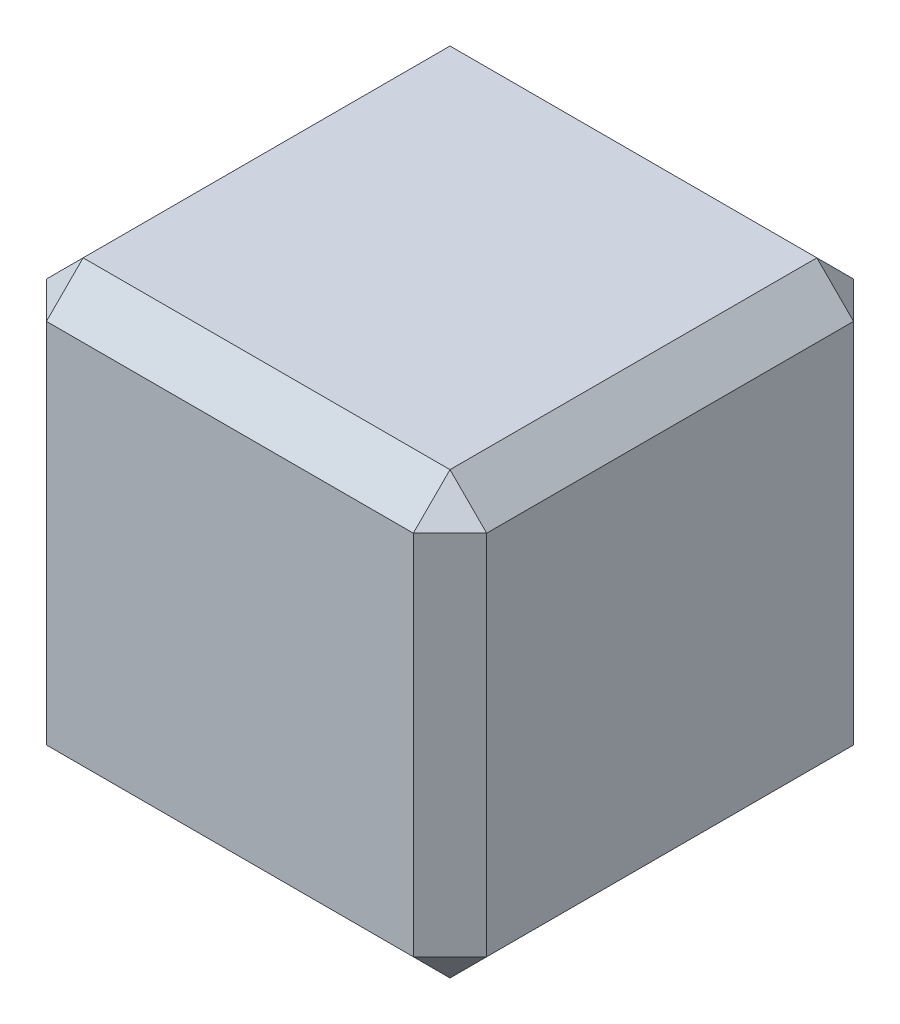
ISO-10303-21;
HEADER;
FILE_DESCRIPTION(('STEP AP214'),'2;1');
FILE_NAME('part.step','',(''),(''),'','','');
FILE_SCHEMA(('AUTOMOTIVE_DESIGN { 1 0 10303 214 1 1 1 1 }'));
ENDSEC;
DATA;
#1=APPLICATION_CONTEXT('core data for automotive mechanical design processes');
#2=APPLICATION_PROTOCOL_DEFINITION('international standard','automotive_design',2000,#1);
#3=PRODUCT_CONTEXT('',#1,'mechanical');
#4=PRODUCT('Part','Part','',(#3));
#5=PRODUCT_RELATED_PRODUCT_CATEGORY('part','',(#4));
#6=PRODUCT_DEFINITION_FORMATION('','',#4);
#7=PRODUCT_DEFINITION_CONTEXT('part definition',#1,'design');
#8=PRODUCT_DEFINITION('design','',#6,#7);
#9=PRODUCT_DEFINITION_SHAPE('','',#8);
#10=(LENGTH_UNIT() NAMED_UNIT(*) SI_UNIT(.MILLI.,.METRE.));
#11=(NAMED_UNIT(*) PLANE_ANGLE_UNIT() SI_UNIT($,.RADIAN.));
#12=(NAMED_UNIT(*) SI_UNIT($,.STERADIAN.) SOLID_ANGLE_UNIT());
#13=UNCERTAINTY_MEASURE_WITH_UNIT(LENGTH_MEASURE(1.E-05),#10,'distance_accuracy_value','');
#14=(GEOMETRIC_REPRESENTATION_CONTEXT(3) GLOBAL_UNCERTAINTY_ASSIGNED_CONTEXT((#13)) GLOBAL_UNIT_ASSIGNED_CONTEXT((#10,
#11,#12)) REPRESENTATION_CONTEXT('',''));
#15=CARTESIAN_POINT('',(0.,0.,0.));
#16=DIRECTION('',(0.,0.,1.));
#17=DIRECTION('',(1.,0.,0.));
#18=AXIS2_PLACEMENT_3D('',#15,#16,#17);
#19=CARTESIAN_POINT('',(3.,3.,-3.));
#20=DIRECTION('',(-1.,0.,0.));
#21=DIRECTION('',(0.,0.,1.));
#22=AXIS2_PLACEMENT_3D('',#19,#20,#21);
#23=PLANE('',#22);
#24=DIRECTION('',(0.,0.,-1.));
#25=VECTOR('',#24,1.);
#26=CARTESIAN_POINT('',(3.,-2.5,-3.));
#27=LINE('',#26,#25);
#28=CARTESIAN_POINT('',(3.,-2.5,2.5));
#29=VERTEX_POINT('',#28);
#30=CARTESIAN_POINT('',(3.,-2.5,-2.5));
#31=VERTEX_POINT('',#30);
#32=EDGE_CURVE('E215',#29,#31,#27,.T.);
#33=ORIENTED_EDGE('',*,*,#32,.T.);
#34=DIRECTION('',(0.,1.,0.));
#35=VECTOR('',#34,1.);
#36=CARTESIAN_POINT('',(3.,3.,-2.5));
#37=LINE('',#36,#35);
#38=CARTESIAN_POINT('',(3.,2.5,-2.5));
#39=VERTEX_POINT('',#38);
#40=EDGE_CURVE('E218',#31,#39,#37,.T.);
#41=ORIENTED_EDGE('',*,*,#40,.T.);
#42=DIRECTION('',(0.,0.,1.));
#43=VECTOR('',#42,1.);
#44=CARTESIAN_POINT('',(3.,2.5,3.));
#45=LINE('',#44,#43);
#46=CARTESIAN_POINT('',(3.,2.5,2.5));
#47=VERTEX_POINT('',#46);
#48=EDGE_CURVE('E216',#39,#47,#45,.T.);
#49=ORIENTED_EDGE('',*,*,#48,.T.);
#50=DIRECTION('',(0.,-1.,0.));
#51=VECTOR('',#50,1.);
#52=CARTESIAN_POINT('',(3.,3.,2.5));
#53=LINE('',#52,#51);
#54=EDGE_CURVE('E212',#47,#29,#53,.T.);
#55=ORIENTED_EDGE('',*,*,#54,.T.);
#56=EDGE_LOOP('',(#33,#41,#49,#55));
#57=FACE_BOUND('',#56,.T.);
#58=ADVANCED_FACE('F33',(#57),#23,.F.);
#59=CARTESIAN_POINT('',(-3.,3.,-3.));
#60=DIRECTION('',(0.,0.,1.));
#61=DIRECTION('',(1.,0.,0.));
#62=AXIS2_PLACEMENT_3D('',#59,#60,#61);
#63=PLANE('',#62);
#64=DIRECTION('',(0.,-1.,0.));
#65=VECTOR('',#64,1.);
#66=CARTESIAN_POINT('',(2.5,3.,-3.));
#67=LINE('',#66,#65);
#68=CARTESIAN_POINT('',(2.5,2.5,-3.));
#69=VERTEX_POINT('',#68);
#70=CARTESIAN_POINT('',(2.5,-2.5,-3.));
#71=VERTEX_POINT('',#70);
#72=EDGE_CURVE('E136',#69,#71,#67,.T.);
#73=ORIENTED_EDGE('',*,*,#72,.T.);
#74=DIRECTION('',(-1.,0.,0.));
#75=VECTOR('',#74,1.);
#76=CARTESIAN_POINT('',(-3.,-2.5,-3.));
#77=LINE('',#76,#75);
#78=CARTESIAN_POINT('',(-2.5,-2.5,-3.));
#79=VERTEX_POINT('',#78);
#80=EDGE_CURVE('E132',#71,#79,#77,.T.);
#81=ORIENTED_EDGE('',*,*,#80,.T.);
#82=DIRECTION('',(0.,1.,0.));
#83=VECTOR('',#82,1.);
#84=CARTESIAN_POINT('',(-2.5,3.,-3.));
#85=LINE('',#84,#83);
#86=CARTESIAN_POINT('',(-2.5,2.5,-3.));
#87=VERTEX_POINT('',#86);
#88=EDGE_CURVE('E126',#79,#87,#85,.T.);
#89=ORIENTED_EDGE('',*,*,#88,.T.);
#90=DIRECTION('',(1.,0.,0.));
#91=VECTOR('',#90,1.);
#92=CARTESIAN_POINT('',(3.,2.5,-3.));
#93=LINE('',#92,#91);
#94=EDGE_CURVE('E129',#87,#69,#93,.T.);
#95=ORIENTED_EDGE('',*,*,#94,.T.);
#96=EDGE_LOOP('',(#73,#81,#89,#95));
#97=FACE_BOUND('',#96,.T.);
#98=ADVANCED_FACE('F128',(#97),#63,.F.);
#99=CARTESIAN_POINT('',(-3.,3.,-3.));
#100=DIRECTION('',(1.,0.,0.));
#101=DIRECTION('',(0.,0.,-1.));
#102=AXIS2_PLACEMENT_3D('',#99,#100,#101);
#103=PLANE('',#102);
#104=DIRECTION('',(0.,-1.,0.));
#105=VECTOR('',#104,1.);
#106=CARTESIAN_POINT('',(-3.,3.,-2.5));
#107=LINE('',#106,#105);
#108=CARTESIAN_POINT('',(-3.,2.5,-2.5));
#109=VERTEX_POINT('',#108);
#110=CARTESIAN_POINT('',(-3.,-2.5,-2.5));
#111=VERTEX_POINT('',#110);
#112=EDGE_CURVE('E151',#109,#111,#107,.T.);
#113=ORIENTED_EDGE('',*,*,#112,.T.);
#114=DIRECTION('',(0.,0.,1.));
#115=VECTOR('',#114,1.);
#116=CARTESIAN_POINT('',(-3.,-2.5,-3.));
#117=LINE('',#116,#115);
#118=CARTESIAN_POINT('',(-3.,-2.5,2.5));
#119=VERTEX_POINT('',#118);
#120=EDGE_CURVE('E275',#111,#119,#117,.T.);
#121=ORIENTED_EDGE('',*,*,#120,.T.);
#122=DIRECTION('',(0.,1.,0.));
#123=VECTOR('',#122,1.);
#124=CARTESIAN_POINT('',(-3.,3.,2.5));
#125=LINE('',#124,#123);
#126=CARTESIAN_POINT('',(-3.,2.5,2.5));
#127=VERTEX_POINT('',#126);
#128=EDGE_CURVE('E268',#119,#127,#125,.T.);
#129=ORIENTED_EDGE('',*,*,#128,.T.);
#130=DIRECTION('',(0.,0.,-1.));
#131=VECTOR('',#130,1.);
#132=CARTESIAN_POINT('',(-3.,2.5,-3.));
#133=LINE('',#132,#131);
#134=EDGE_CURVE('E266',#127,#109,#133,.T.);
#135=ORIENTED_EDGE('',*,*,#134,.T.);
#136=EDGE_LOOP('',(#113,#121,#129,#135));
#137=FACE_BOUND('',#136,.T.);
#138=ADVANCED_FACE('F323',(#137),#103,.F.);
#139=CARTESIAN_POINT('',(-3.,3.,3.));
#140=DIRECTION('',(0.,0.,-1.));
#141=DIRECTION('',(-1.,0.,0.));
#142=AXIS2_PLACEMENT_3D('',#139,#140,#141);
#143=PLANE('',#142);
#144=DIRECTION('',(-1.,0.,0.));
#145=VECTOR('',#144,1.);
#146=CARTESIAN_POINT('',(-3.,2.5,3.));
#147=LINE('',#146,#145);
#148=CARTESIAN_POINT('',(2.5,2.5,3.));
#149=VERTEX_POINT('',#148);
#150=CARTESIAN_POINT('',(-2.5,2.5,3.));
#151=VERTEX_POINT('',#150);
#152=EDGE_CURVE('E278',#149,#151,#147,.T.);
#153=ORIENTED_EDGE('',*,*,#152,.T.);
#154=DIRECTION('',(0.,-1.,0.));
#155=VECTOR('',#154,1.);
#156=CARTESIAN_POINT('',(-2.5,3.,3.));
#157=LINE('',#156,#155);
#158=CARTESIAN_POINT('',(-2.5,-2.5,3.));
#159=VERTEX_POINT('',#158);
#160=EDGE_CURVE('E220',#151,#159,#157,.T.);
#161=ORIENTED_EDGE('',*,*,#160,.T.);
#162=DIRECTION('',(1.,0.,0.));
#163=VECTOR('',#162,1.);
#164=CARTESIAN_POINT('',(-3.,-2.5,3.));
#165=LINE('',#164,#163);
#166=CARTESIAN_POINT('',(2.5,-2.5,3.));
#167=VERTEX_POINT('',#166);
#168=EDGE_CURVE('E281',#159,#167,#165,.T.);
#169=ORIENTED_EDGE('',*,*,#168,.T.);
#170=DIRECTION('',(0.,1.,0.));
#171=VECTOR('',#170,1.);
#172=CARTESIAN_POINT('',(2.5,3.,3.));
#173=LINE('',#172,#171);
#174=EDGE_CURVE('E210',#167,#149,#173,.T.);
#175=ORIENTED_EDGE('',*,*,#174,.T.);
#176=EDGE_LOOP('',(#153,#161,#169,#175));
#177=FACE_BOUND('',#176,.T.);
#178=ADVANCED_FACE('F285',(#177),#143,.F.);
#179=CARTESIAN_POINT('',(0.,3.,0.));
#180=DIRECTION('',(0.,1.,0.));
#181=DIRECTION('',(0.,0.,1.));
#182=AXIS2_PLACEMENT_3D('',#179,#180,#181);
#183=PLANE('',#182);
#184=DIRECTION('',(0.,0.,-1.));
#185=VECTOR('',#184,1.);
#186=CARTESIAN_POINT('',(2.5,3.,-3.));
#187=LINE('',#186,#185);
#188=CARTESIAN_POINT('',(2.5,3.,2.5));
#189=VERTEX_POINT('',#188);
#190=CARTESIAN_POINT('',(2.5,3.,-2.5));
#191=VERTEX_POINT('',#190);
#192=EDGE_CURVE('E57',#189,#191,#187,.T.);
#193=ORIENTED_EDGE('',*,*,#192,.T.);
#194=DIRECTION('',(-1.,0.,0.));
#195=VECTOR('',#194,1.);
#196=CARTESIAN_POINT('',(-3.,3.,-2.5));
#197=LINE('',#196,#195);
#198=CARTESIAN_POINT('',(-2.5,3.,-2.5));
#199=VERTEX_POINT('',#198);
#200=EDGE_CURVE('E11',#191,#199,#197,.T.);
#201=ORIENTED_EDGE('',*,*,#200,.T.);
#202=DIRECTION('',(0.,0.,1.));
#203=VECTOR('',#202,1.);
#204=CARTESIAN_POINT('',(-2.5,3.,3.));
#205=LINE('',#204,#203);
#206=CARTESIAN_POINT('',(-2.5,3.,2.5));
#207=VERTEX_POINT('',#206);
#208=EDGE_CURVE('E42',#199,#207,#205,.T.);
#209=ORIENTED_EDGE('',*,*,#208,.T.);
#210=DIRECTION('',(1.,0.,0.));
#211=VECTOR('',#210,1.);
#212=CARTESIAN_POINT('',(3.,3.,2.5));
#213=LINE('',#212,#211);
#214=EDGE_CURVE('E226',#207,#189,#213,.T.);
#215=ORIENTED_EDGE('',*,*,#214,.T.);
#216=EDGE_LOOP('',(#193,#201,#209,#215));
#217=FACE_BOUND('',#216,.T.);
#218=ADVANCED_FACE('F375',(#217),#183,.T.);
#219=CARTESIAN_POINT('',(0.,-3.,0.));
#220=DIRECTION('',(0.,1.,0.));
#221=DIRECTION('',(0.,0.,1.));
#222=AXIS2_PLACEMENT_3D('',#219,#220,#221);
#223=PLANE('',#222);
#224=DIRECTION('',(0.,0.,-1.));
#225=VECTOR('',#224,1.);
#226=CARTESIAN_POINT('',(-2.5,-3.,0.));
#227=LINE('',#226,#225);
#228=CARTESIAN_POINT('',(-2.5,-3.,2.5));
#229=VERTEX_POINT('',#228);
#230=CARTESIAN_POINT('',(-2.5,-3.,-2.5));
#231=VERTEX_POINT('',#230);
#232=EDGE_CURVE('E262',#229,#231,#227,.T.);
#233=ORIENTED_EDGE('',*,*,#232,.T.);
#234=DIRECTION('',(1.,0.,0.));
#235=VECTOR('',#234,1.);
#236=CARTESIAN_POINT('',(0.,-3.,-2.5));
#237=LINE('',#236,#235);
#238=CARTESIAN_POINT('',(2.5,-3.,-2.5));
#239=VERTEX_POINT('',#238);
#240=EDGE_CURVE('E259',#231,#239,#237,.T.);
#241=ORIENTED_EDGE('',*,*,#240,.T.);
#242=DIRECTION('',(0.,0.,1.));
#243=VECTOR('',#242,1.);
#244=CARTESIAN_POINT('',(2.5,-3.,0.));
#245=LINE('',#244,#243);
#246=CARTESIAN_POINT('',(2.5,-3.,2.5));
#247=VERTEX_POINT('',#246);
#248=EDGE_CURVE('E251',#239,#247,#245,.T.);
#249=ORIENTED_EDGE('',*,*,#248,.T.);
#250=DIRECTION('',(-1.,0.,0.));
#251=VECTOR('',#250,1.);
#252=CARTESIAN_POINT('',(0.,-3.,2.5));
#253=LINE('',#252,#251);
#254=EDGE_CURVE('E256',#247,#229,#253,.T.);
#255=ORIENTED_EDGE('',*,*,#254,.T.);
#256=EDGE_LOOP('',(#233,#241,#249,#255));
#257=FACE_BOUND('',#256,.T.);
#258=ADVANCED_FACE('F260',(#257),#223,.F.);
#259=CARTESIAN_POINT('',(0.,3.,2.5));
#260=DIRECTION('',(0.,0.707106781186546,0.707106781186549));
#261=DIRECTION('',(-1.,0.,0.));
#262=AXIS2_PLACEMENT_3D('',#259,#260,#261);
#263=PLANE('',#262);
#264=DIRECTION('',(0.,-0.707106781186549,0.707106781186546));
#265=VECTOR('',#264,1.);
#266=CARTESIAN_POINT('',(2.5,2.5,3.));
#267=LINE('',#266,#265);
#268=EDGE_CURVE('E37',#189,#149,#267,.T.);
#269=ORIENTED_EDGE('',*,*,#268,.F.);
#270=ORIENTED_EDGE('',*,*,#214,.F.);
#271=DIRECTION('',(0.,0.707106781186549,-0.707106781186546));
#272=VECTOR('',#271,1.);
#273=CARTESIAN_POINT('',(-2.5,2.75,2.75));
#274=LINE('',#273,#272);
#275=EDGE_CURVE('E190',#151,#207,#274,.T.);
#276=ORIENTED_EDGE('',*,*,#275,.F.);
#277=ORIENTED_EDGE('',*,*,#152,.F.);
#278=EDGE_LOOP('',(#269,#270,#276,#277));
#279=FACE_BOUND('',#278,.T.);
#280=ADVANCED_FACE('F35',(#279),#263,.T.);
#281=CARTESIAN_POINT('',(2.5,2.5,3.));
#282=DIRECTION('',(0.577350269189626,0.577350269189623,0.577350269189629));
#283=DIRECTION('',(0.707106781186549,0.,-0.707106781186546));
#284=AXIS2_PLACEMENT_3D('',#281,#282,#283);
#285=PLANE('',#284);
#286=DIRECTION('',(-0.707106781186546,0.707106781186549,0.));
#287=VECTOR('',#286,1.);
#288=CARTESIAN_POINT('',(2.75,2.75,2.5));
#289=LINE('',#288,#287);
#290=EDGE_CURVE('E185',#189,#47,#289,.F.);
#291=ORIENTED_EDGE('',*,*,#290,.F.);
#292=ORIENTED_EDGE('',*,*,#268,.T.);
#293=DIRECTION('',(-0.707106781186549,0.,0.707106781186546));
#294=VECTOR('',#293,1.);
#295=CARTESIAN_POINT('',(2.5,2.5,3.));
#296=LINE('',#295,#294);
#297=EDGE_CURVE('E188',#47,#149,#296,.T.);
#298=ORIENTED_EDGE('',*,*,#297,.F.);
#299=EDGE_LOOP('',(#291,#292,#298));
#300=FACE_BOUND('',#299,.T.);
#301=ADVANCED_FACE('F201',(#300),#285,.T.);
#302=CARTESIAN_POINT('',(-3.,2.5,2.5));
#303=DIRECTION('',(-0.577350269189626,0.577350269189623,0.577350269189629));
#304=DIRECTION('',(0.707106781186549,0.,0.707106781186546));
#305=AXIS2_PLACEMENT_3D('',#302,#303,#304);
#306=PLANE('',#305);
#307=DIRECTION('',(-0.707106781186549,0.,-0.707106781186546));
#308=VECTOR('',#307,1.);
#309=CARTESIAN_POINT('',(-3.,2.5,2.5));
#310=LINE('',#309,#308);
#311=EDGE_CURVE('E179',#151,#127,#310,.T.);
#312=ORIENTED_EDGE('',*,*,#311,.F.);
#313=ORIENTED_EDGE('',*,*,#275,.T.);
#314=DIRECTION('',(-0.707106781186546,-0.707106781186549,0.));
#315=VECTOR('',#314,1.);
#316=CARTESIAN_POINT('',(-3.,2.5,2.5));
#317=LINE('',#316,#315);
#318=EDGE_CURVE('E182',#127,#207,#317,.F.);
#319=ORIENTED_EDGE('',*,*,#318,.F.);
#320=EDGE_LOOP('',(#312,#313,#319));
#321=FACE_BOUND('',#320,.T.);
#322=ADVANCED_FACE('F316',(#321),#306,.T.);
#323=CARTESIAN_POINT('',(3.,3.,2.5));
#324=DIRECTION('',(-0.707106781186546,0.,-0.707106781186549));
#325=DIRECTION('',(0.,-1.,0.));
#326=AXIS2_PLACEMENT_3D('',#323,#324,#325);
#327=PLANE('',#326);
#328=ORIENTED_EDGE('',*,*,#297,.T.);
#329=ORIENTED_EDGE('',*,*,#174,.F.);
#330=DIRECTION('',(0.707106781186549,0.,-0.707106781186546));
#331=VECTOR('',#330,1.);
#332=CARTESIAN_POINT('',(2.5,-2.5,3.));
#333=LINE('',#332,#331);
#334=EDGE_CURVE('E173',#29,#167,#333,.F.);
#335=ORIENTED_EDGE('',*,*,#334,.F.);
#336=ORIENTED_EDGE('',*,*,#54,.F.);
#337=EDGE_LOOP('',(#328,#329,#335,#336));
#338=FACE_BOUND('',#337,.T.);
#339=ADVANCED_FACE('F208',(#338),#327,.F.);
#340=CARTESIAN_POINT('',(2.5,3.,0.));
#341=DIRECTION('',(0.707106781186549,0.707106781186546,0.));
#342=DIRECTION('',(0.,0.,1.));
#343=AXIS2_PLACEMENT_3D('',#340,#341,#342);
#344=PLANE('',#343);
#345=ORIENTED_EDGE('',*,*,#290,.T.);
#346=ORIENTED_EDGE('',*,*,#48,.F.);
#347=DIRECTION('',(0.707106781186546,-0.707106781186549,0.));
#348=VECTOR('',#347,1.);
#349=CARTESIAN_POINT('',(3.,2.5,-2.5));
#350=LINE('',#349,#348);
#351=EDGE_CURVE('E170',#191,#39,#350,.T.);
#352=ORIENTED_EDGE('',*,*,#351,.F.);
#353=ORIENTED_EDGE('',*,*,#192,.F.);
#354=EDGE_LOOP('',(#345,#346,#352,#353));
#355=FACE_BOUND('',#354,.T.);
#356=ADVANCED_FACE('F307',(#355),#344,.T.);
#357=CARTESIAN_POINT('',(0.,3.,-2.5));
#358=DIRECTION('',(0.,0.707106781186546,-0.707106781186549));
#359=DIRECTION('',(1.,0.,0.));
#360=AXIS2_PLACEMENT_3D('',#357,#358,#359);
#361=PLANE('',#360);
#362=DIRECTION('',(0.,-0.707106781186549,-0.707106781186546));
#363=VECTOR('',#362,1.);
#364=CARTESIAN_POINT('',(-2.5,2.5,-3.));
#365=LINE('',#364,#363);
#366=EDGE_CURVE('E140',#199,#87,#365,.T.);
#367=ORIENTED_EDGE('',*,*,#366,.F.);
#368=ORIENTED_EDGE('',*,*,#200,.F.);
#369=DIRECTION('',(0.,0.707106781186549,0.707106781186546));
#370=VECTOR('',#369,1.);
#371=CARTESIAN_POINT('',(2.5,2.75,-2.75));
#372=LINE('',#371,#370);
#373=EDGE_CURVE('E143',#69,#191,#372,.T.);
#374=ORIENTED_EDGE('',*,*,#373,.F.);
#375=ORIENTED_EDGE('',*,*,#94,.F.);
#376=EDGE_LOOP('',(#367,#368,#374,#375));
#377=FACE_BOUND('',#376,.T.);
#378=ADVANCED_FACE('F139',(#377),#361,.T.);
#379=CARTESIAN_POINT('',(-2.5,3.,0.));
#380=DIRECTION('',(-0.707106781186549,0.707106781186546,0.));
#381=DIRECTION('',(0.,0.,-1.));
#382=AXIS2_PLACEMENT_3D('',#379,#380,#381);
#383=PLANE('',#382);
#384=ORIENTED_EDGE('',*,*,#318,.T.);
#385=ORIENTED_EDGE('',*,*,#208,.F.);
#386=DIRECTION('',(0.707106781186546,0.707106781186549,0.));
#387=VECTOR('',#386,1.);
#388=CARTESIAN_POINT('',(-2.75,2.75,-2.5));
#389=LINE('',#388,#387);
#390=EDGE_CURVE('E50',#109,#199,#389,.T.);
#391=ORIENTED_EDGE('',*,*,#390,.F.);
#392=ORIENTED_EDGE('',*,*,#134,.F.);
#393=EDGE_LOOP('',(#384,#385,#391,#392));
#394=FACE_BOUND('',#393,.T.);
#395=ADVANCED_FACE('F314',(#394),#383,.T.);
#396=CARTESIAN_POINT('',(-2.5,3.,3.));
#397=DIRECTION('',(0.707106781186546,0.,-0.707106781186549));
#398=DIRECTION('',(0.,-1.,0.));
#399=AXIS2_PLACEMENT_3D('',#396,#397,#398);
#400=PLANE('',#399);
#401=ORIENTED_EDGE('',*,*,#311,.T.);
#402=ORIENTED_EDGE('',*,*,#128,.F.);
#403=DIRECTION('',(0.707106781186549,0.,0.707106781186546));
#404=VECTOR('',#403,1.);
#405=CARTESIAN_POINT('',(-3.,-2.5,2.5));
#406=LINE('',#405,#404);
#407=EDGE_CURVE('E165',#159,#119,#406,.F.);
#408=ORIENTED_EDGE('',*,*,#407,.F.);
#409=ORIENTED_EDGE('',*,*,#160,.F.);
#410=EDGE_LOOP('',(#401,#402,#408,#409));
#411=FACE_BOUND('',#410,.T.);
#412=ADVANCED_FACE('F289',(#411),#400,.F.);
#413=CARTESIAN_POINT('',(-3.,-2.5,3.));
#414=DIRECTION('',(0.,0.707106781186546,-0.707106781186549));
#415=DIRECTION('',(1.,0.,0.));
#416=AXIS2_PLACEMENT_3D('',#413,#414,#415);
#417=PLANE('',#416);
#418=DIRECTION('',(0.,0.707106781186549,0.707106781186546));
#419=VECTOR('',#418,1.);
#420=CARTESIAN_POINT('',(2.5,-2.5,3.));
#421=LINE('',#420,#419);
#422=EDGE_CURVE('E176',#167,#247,#421,.F.);
#423=ORIENTED_EDGE('',*,*,#422,.F.);
#424=ORIENTED_EDGE('',*,*,#168,.F.);
#425=DIRECTION('',(0.,-0.707106781186549,-0.707106781186546));
#426=VECTOR('',#425,1.);
#427=CARTESIAN_POINT('',(-2.5,-2.75,2.75));
#428=LINE('',#427,#426);
#429=EDGE_CURVE('E163',#229,#159,#428,.F.);
#430=ORIENTED_EDGE('',*,*,#429,.F.);
#431=ORIENTED_EDGE('',*,*,#254,.F.);
#432=EDGE_LOOP('',(#423,#424,#430,#431));
#433=FACE_BOUND('',#432,.T.);
#434=ADVANCED_FACE('F295',(#433),#417,.F.);
#435=CARTESIAN_POINT('',(2.5,-2.5,3.));
#436=DIRECTION('',(0.577350269189623,-0.577350269189626,0.577350269189629));
#437=DIRECTION('',(0.,-0.707106781186549,-0.707106781186546));
#438=AXIS2_PLACEMENT_3D('',#435,#436,#437);
#439=PLANE('',#438);
#440=ORIENTED_EDGE('',*,*,#334,.T.);
#441=ORIENTED_EDGE('',*,*,#422,.T.);
#442=DIRECTION('',(-0.707106781186549,-0.707106781186546,0.));
#443=VECTOR('',#442,1.);
#444=CARTESIAN_POINT('',(2.75,-2.75,2.5));
#445=LINE('',#444,#443);
#446=EDGE_CURVE('E155',#29,#247,#445,.T.);
#447=ORIENTED_EDGE('',*,*,#446,.F.);
#448=EDGE_LOOP('',(#440,#441,#447));
#449=FACE_BOUND('',#448,.T.);
#450=ADVANCED_FACE('F297',(#449),#439,.T.);
#451=CARTESIAN_POINT('',(3.,2.5,-2.5));
#452=DIRECTION('',(0.577350269189629,0.577350269189623,-0.577350269189626));
#453=DIRECTION('',(-0.707106781186546,0.,-0.707106781186549));
#454=AXIS2_PLACEMENT_3D('',#451,#452,#453);
#455=PLANE('',#454);
#456=ORIENTED_EDGE('',*,*,#373,.T.);
#457=ORIENTED_EDGE('',*,*,#351,.T.);
#458=DIRECTION('',(0.707106781186546,0.,0.707106781186549));
#459=VECTOR('',#458,1.);
#460=CARTESIAN_POINT('',(3.,2.5,-2.5));
#461=LINE('',#460,#459);
#462=EDGE_CURVE('E152',#69,#39,#461,.T.);
#463=ORIENTED_EDGE('',*,*,#462,.F.);
#464=EDGE_LOOP('',(#456,#457,#463));
#465=FACE_BOUND('',#464,.T.);
#466=ADVANCED_FACE('F305',(#465),#455,.T.);
#467=CARTESIAN_POINT('',(-2.5,2.5,-3.));
#468=DIRECTION('',(-0.577350269189626,0.577350269189623,-0.577350269189629));
#469=DIRECTION('',(-0.707106781186549,0.,0.707106781186546));
#470=AXIS2_PLACEMENT_3D('',#467,#468,#469);
#471=PLANE('',#470);
#472=ORIENTED_EDGE('',*,*,#390,.T.);
#473=ORIENTED_EDGE('',*,*,#366,.T.);
#474=DIRECTION('',(0.707106781186549,0.,-0.707106781186546));
#475=VECTOR('',#474,1.);
#476=CARTESIAN_POINT('',(-2.5,2.5,-3.));
#477=LINE('',#476,#475);
#478=EDGE_CURVE('E147',#109,#87,#477,.T.);
#479=ORIENTED_EDGE('',*,*,#478,.F.);
#480=EDGE_LOOP('',(#472,#473,#479));
#481=FACE_BOUND('',#480,.T.);
#482=ADVANCED_FACE('F146',(#481),#471,.T.);
#483=CARTESIAN_POINT('',(-3.,-2.5,2.5));
#484=DIRECTION('',(-0.577350269189623,-0.577350269189626,0.577350269189629));
#485=DIRECTION('',(0.,-0.707106781186549,-0.707106781186546));
#486=AXIS2_PLACEMENT_3D('',#483,#484,#485);
#487=PLANE('',#486);
#488=ORIENTED_EDGE('',*,*,#429,.T.);
#489=ORIENTED_EDGE('',*,*,#407,.T.);
#490=DIRECTION('',(-0.707106781186549,0.707106781186546,0.));
#491=VECTOR('',#490,1.);
#492=CARTESIAN_POINT('',(-3.,-2.5,2.5));
#493=LINE('',#492,#491);
#494=EDGE_CURVE('E153',#229,#119,#493,.T.);
#495=ORIENTED_EDGE('',*,*,#494,.F.);
#496=EDGE_LOOP('',(#488,#489,#495));
#497=FACE_BOUND('',#496,.T.);
#498=ADVANCED_FACE('F346',(#497),#487,.T.);
#499=CARTESIAN_POINT('',(3.,-2.5,-3.));
#500=DIRECTION('',(-0.707106781186546,0.707106781186549,0.));
#501=DIRECTION('',(0.,0.,-1.));
#502=AXIS2_PLACEMENT_3D('',#499,#500,#501);
#503=PLANE('',#502);
#504=ORIENTED_EDGE('',*,*,#446,.T.);
#505=ORIENTED_EDGE('',*,*,#248,.F.);
#506=DIRECTION('',(0.707106781186549,0.707106781186546,0.));
#507=VECTOR('',#506,1.);
#508=CARTESIAN_POINT('',(2.5,-3.,-2.5));
#509=LINE('',#508,#507);
#510=EDGE_CURVE('E157',#31,#239,#509,.F.);
#511=ORIENTED_EDGE('',*,*,#510,.F.);
#512=ORIENTED_EDGE('',*,*,#32,.F.);
#513=EDGE_LOOP('',(#504,#505,#511,#512));
#514=FACE_BOUND('',#513,.T.);
#515=ADVANCED_FACE('F253',(#514),#503,.F.);
#516=CARTESIAN_POINT('',(2.5,3.,-3.));
#517=DIRECTION('',(-0.707106781186549,0.,0.707106781186546));
#518=DIRECTION('',(0.,-1.,0.));
#519=AXIS2_PLACEMENT_3D('',#516,#517,#518);
#520=PLANE('',#519);
#521=ORIENTED_EDGE('',*,*,#462,.T.);
#522=ORIENTED_EDGE('',*,*,#40,.F.);
#523=DIRECTION('',(-0.707106781186546,0.,-0.707106781186549));
#524=VECTOR('',#523,1.);
#525=CARTESIAN_POINT('',(2.75,-2.5,-2.75));
#526=LINE('',#525,#524);
#527=EDGE_CURVE('E240',#71,#31,#526,.F.);
#528=ORIENTED_EDGE('',*,*,#527,.F.);
#529=ORIENTED_EDGE('',*,*,#72,.F.);
#530=EDGE_LOOP('',(#521,#522,#528,#529));
#531=FACE_BOUND('',#530,.T.);
#532=ADVANCED_FACE('F300',(#531),#520,.F.);
#533=CARTESIAN_POINT('',(-3.,3.,-2.5));
#534=DIRECTION('',(0.707106781186546,0.,0.707106781186549));
#535=DIRECTION('',(0.,-1.,0.));
#536=AXIS2_PLACEMENT_3D('',#533,#534,#535);
#537=PLANE('',#536);
#538=ORIENTED_EDGE('',*,*,#478,.T.);
#539=ORIENTED_EDGE('',*,*,#88,.F.);
#540=DIRECTION('',(-0.707106781186549,0.,0.707106781186546));
#541=VECTOR('',#540,1.);
#542=CARTESIAN_POINT('',(-2.5,-2.5,-3.));
#543=LINE('',#542,#541);
#544=EDGE_CURVE('E237',#111,#79,#543,.F.);
#545=ORIENTED_EDGE('',*,*,#544,.F.);
#546=ORIENTED_EDGE('',*,*,#112,.F.);
#547=EDGE_LOOP('',(#538,#539,#545,#546));
#548=FACE_BOUND('',#547,.T.);
#549=ADVANCED_FACE('F150',(#548),#537,.F.);
#550=CARTESIAN_POINT('',(-3.,-2.5,-3.));
#551=DIRECTION('',(0.707106781186546,0.707106781186549,0.));
#552=DIRECTION('',(0.,0.,1.));
#553=AXIS2_PLACEMENT_3D('',#550,#551,#552);
#554=PLANE('',#553);
#555=ORIENTED_EDGE('',*,*,#494,.T.);
#556=ORIENTED_EDGE('',*,*,#120,.F.);
#557=DIRECTION('',(0.707106781186549,-0.707106781186546,0.));
#558=VECTOR('',#557,1.);
#559=CARTESIAN_POINT('',(-2.75,-2.75,-2.5));
#560=LINE('',#559,#558);
#561=EDGE_CURVE('E234',#231,#111,#560,.F.);
#562=ORIENTED_EDGE('',*,*,#561,.F.);
#563=ORIENTED_EDGE('',*,*,#232,.F.);
#564=EDGE_LOOP('',(#555,#556,#562,#563));
#565=FACE_BOUND('',#564,.T.);
#566=ADVANCED_FACE('F336',(#565),#554,.F.);
#567=CARTESIAN_POINT('',(2.5,-3.,-2.5));
#568=DIRECTION('',(0.577350269189626,-0.577350269189629,-0.577350269189623));
#569=DIRECTION('',(0.707106781186549,0.707106781186546,0.));
#570=AXIS2_PLACEMENT_3D('',#567,#568,#569);
#571=PLANE('',#570);
#572=ORIENTED_EDGE('',*,*,#527,.T.);
#573=ORIENTED_EDGE('',*,*,#510,.T.);
#574=DIRECTION('',(0.,-0.707106781186546,0.707106781186549));
#575=VECTOR('',#574,1.);
#576=CARTESIAN_POINT('',(2.5,-3.,-2.5));
#577=LINE('',#576,#575);
#578=EDGE_CURVE('E232',#71,#239,#577,.T.);
#579=ORIENTED_EDGE('',*,*,#578,.F.);
#580=EDGE_LOOP('',(#572,#573,#579));
#581=FACE_BOUND('',#580,.T.);
#582=ADVANCED_FACE('F247',(#581),#571,.T.);
#583=CARTESIAN_POINT('',(-2.5,-2.5,-3.));
#584=DIRECTION('',(-0.577350269189623,-0.577350269189629,-0.577350269189626));
#585=DIRECTION('',(0.,0.707106781186546,-0.707106781186549));
#586=AXIS2_PLACEMENT_3D('',#583,#584,#585);
#587=PLANE('',#586);
#588=ORIENTED_EDGE('',*,*,#561,.T.);
#589=ORIENTED_EDGE('',*,*,#544,.T.);
#590=DIRECTION('',(0.,0.707106781186546,-0.707106781186549));
#591=VECTOR('',#590,1.);
#592=CARTESIAN_POINT('',(-2.5,-2.5,-3.));
#593=LINE('',#592,#591);
#594=EDGE_CURVE('E230',#231,#79,#593,.T.);
#595=ORIENTED_EDGE('',*,*,#594,.F.);
#596=EDGE_LOOP('',(#588,#589,#595));
#597=FACE_BOUND('',#596,.T.);
#598=ADVANCED_FACE('F330',(#597),#587,.T.);
#599=CARTESIAN_POINT('',(-3.,-2.5,-3.));
#600=DIRECTION('',(0.,0.707106781186549,0.707106781186546));
#601=DIRECTION('',(-1.,0.,0.));
#602=AXIS2_PLACEMENT_3D('',#599,#600,#601);
#603=PLANE('',#602);
#604=ORIENTED_EDGE('',*,*,#578,.T.);
#605=ORIENTED_EDGE('',*,*,#240,.F.);
#606=ORIENTED_EDGE('',*,*,#594,.T.);
#607=ORIENTED_EDGE('',*,*,#80,.F.);
#608=EDGE_LOOP('',(#604,#605,#606,#607));
#609=FACE_BOUND('',#608,.T.);
#610=ADVANCED_FACE('F327',(#609),#603,.F.);
#611=CLOSED_SHELL('',(#58,#98,#138,#178,#218,#258,#280,#301,#322,#339,#356,#378,#395,#412,#434,
#450,#466,#482,#498,#515,#532,#549,#566,#582,#598,#610));
#612=MANIFOLD_SOLID_BREP('B2',#611);
#613=ADVANCED_BREP_SHAPE_REPRESENTATION('',(#18,#612),#14);
#614=SHAPE_DEFINITION_REPRESENTATION(#9,#613);
ENDSEC;
END-ISO-10303-21;
